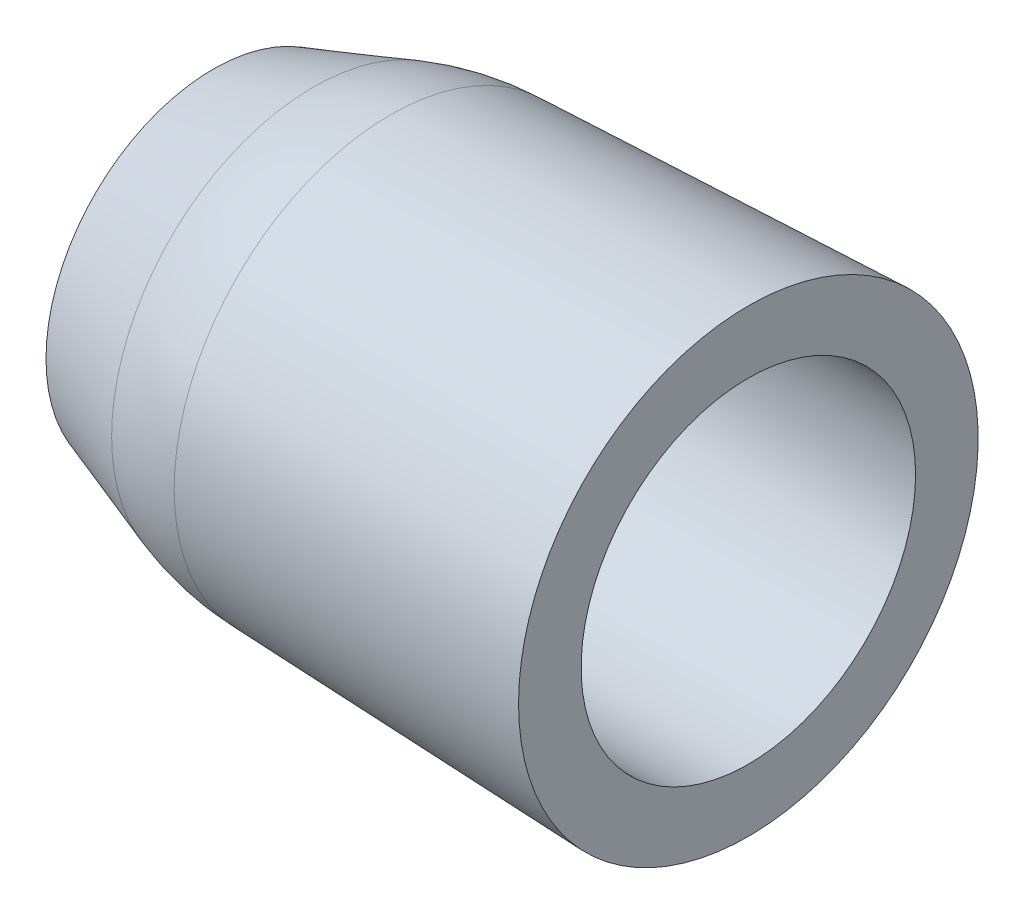
ISO-10303-21;
HEADER;
FILE_DESCRIPTION(('STEP AP214'),'2;1');
FILE_NAME('part.step','',(''),(''),'','','');
FILE_SCHEMA(('AUTOMOTIVE_DESIGN { 1 0 10303 214 1 1 1 1 }'));
ENDSEC;
DATA;
#1=APPLICATION_CONTEXT('core data for automotive mechanical design processes');
#2=APPLICATION_PROTOCOL_DEFINITION('international standard','automotive_design',2000,#1);
#3=PRODUCT_CONTEXT('',#1,'mechanical');
#4=PRODUCT('Part','Part','',(#3));
#5=PRODUCT_RELATED_PRODUCT_CATEGORY('part','',(#4));
#6=PRODUCT_DEFINITION_FORMATION('','',#4);
#7=PRODUCT_DEFINITION_CONTEXT('part definition',#1,'design');
#8=PRODUCT_DEFINITION('design','',#6,#7);
#9=PRODUCT_DEFINITION_SHAPE('','',#8);
#10=(LENGTH_UNIT() NAMED_UNIT(*) SI_UNIT(.MILLI.,.METRE.));
#11=(NAMED_UNIT(*) PLANE_ANGLE_UNIT() SI_UNIT($,.RADIAN.));
#12=(NAMED_UNIT(*) SI_UNIT($,.STERADIAN.) SOLID_ANGLE_UNIT());
#13=UNCERTAINTY_MEASURE_WITH_UNIT(LENGTH_MEASURE(1.E-05),#10,'distance_accuracy_value','');
#14=(GEOMETRIC_REPRESENTATION_CONTEXT(3) GLOBAL_UNCERTAINTY_ASSIGNED_CONTEXT((#13)) GLOBAL_UNIT_ASSIGNED_CONTEXT((#10,
#11,#12)) REPRESENTATION_CONTEXT('',''));
#15=CARTESIAN_POINT('',(0.,0.,0.));
#16=DIRECTION('',(0.,0.,1.));
#17=DIRECTION('',(1.,0.,0.));
#18=AXIS2_PLACEMENT_3D('',#15,#16,#17);
#19=CARTESIAN_POINT('',(-27.8094984746048,0.,0.));
#20=DIRECTION('',(1.,0.,0.));
#21=DIRECTION('',(0.,0.,-1.));
#22=AXIS2_PLACEMENT_3D('',#19,#20,#21);
#23=PLANE('',#22);
#24=CARTESIAN_POINT('',(-27.8094984746048,0.,0.));
#25=DIRECTION('',(-1.,0.,0.));
#26=DIRECTION('',(0.,0.,1.));
#27=AXIS2_PLACEMENT_3D('',#24,#25,#26);
#28=CIRCLE('',#27,7.9375);
#29=CARTESIAN_POINT('',(-27.8094984746048,0.,7.9375));
#30=VERTEX_POINT('',#29);
#31=EDGE_CURVE('E53',#30,#30,#28,.T.);
#32=ORIENTED_EDGE('',*,*,#31,.T.);
#33=EDGE_LOOP('',(#32));
#34=FACE_BOUND('',#33,.T.);
#35=ADVANCED_FACE('F38',(#34),#23,.F.);
#36=CARTESIAN_POINT('',(-2.40949847460481,0.,0.));
#37=DIRECTION('',(1.,0.,0.));
#38=DIRECTION('',(0.,0.,-1.));
#39=AXIS2_PLACEMENT_3D('',#36,#37,#38);
#40=PLANE('',#39);
#41=CARTESIAN_POINT('',(-2.40949847460481,0.,0.));
#42=DIRECTION('',(1.,0.,0.));
#43=DIRECTION('',(0.,0.,-1.));
#44=AXIS2_PLACEMENT_3D('',#41,#42,#43);
#45=CIRCLE('',#44,7.9375);
#46=CARTESIAN_POINT('',(-2.40949847460481,0.,-7.9375));
#47=VERTEX_POINT('',#46);
#48=EDGE_CURVE('E59',#47,#47,#45,.T.);
#49=ORIENTED_EDGE('',*,*,#48,.F.);
#50=EDGE_LOOP('',(#49));
#51=FACE_BOUND('',#50,.T.);
#52=CARTESIAN_POINT('',(-2.40949847460481,0.,0.));
#53=DIRECTION('',(-1.,0.,0.));
#54=DIRECTION('',(0.,0.,1.));
#55=AXIS2_PLACEMENT_3D('',#52,#53,#54);
#56=CIRCLE('',#55,10.9078164293921);
#57=CARTESIAN_POINT('',(-2.40949847460481,0.,10.9078164293921));
#58=VERTEX_POINT('',#57);
#59=EDGE_CURVE('E49',#58,#58,#56,.T.);
#60=ORIENTED_EDGE('',*,*,#59,.F.);
#61=EDGE_LOOP('',(#60));
#62=FACE_BOUND('',#61,.T.);
#63=ADVANCED_FACE('F74',(#51,#62),#40,.T.);
#64=CARTESIAN_POINT('',(-2.40949847460481,0.,0.));
#65=DIRECTION('',(1.,0.,0.));
#66=DIRECTION('',(0.,0.,-1.));
#67=AXIS2_PLACEMENT_3D('',#64,#65,#66);
#68=CONICAL_SURFACE('',#67,10.9078164293921,0.0381929089258036);
#69=CARTESIAN_POINT('',(-19.4046955685931,0.,0.));
#70=DIRECTION('',(-1.,0.,0.));
#71=DIRECTION('',(0.,0.,1.));
#72=AXIS2_PLACEMENT_3D('',#69,#70,#71);
#73=CIRCLE('',#72,10.2584046185942);
#74=CARTESIAN_POINT('',(-19.4046955685931,0.,10.2584046185942));
#75=VERTEX_POINT('',#74);
#76=EDGE_CURVE('E10',#75,#75,#73,.F.);
#77=ORIENTED_EDGE('',*,*,#76,.T.);
#78=EDGE_LOOP('',(#77));
#79=FACE_BOUND('',#78,.T.);
#80=ORIENTED_EDGE('',*,*,#59,.T.);
#81=EDGE_LOOP('',(#80));
#82=FACE_BOUND('',#81,.T.);
#83=ADVANCED_FACE('F77',(#79,#82),#68,.T.);
#84=CARTESIAN_POINT('',(-21.2812055003922,0.,0.));
#85=DIRECTION('',(1.,0.,0.));
#86=DIRECTION('',(0.,0.,-1.));
#87=AXIS2_PLACEMENT_3D('',#84,#85,#86);
#88=CONICAL_SURFACE('',#87,10.1867003773282,0.331794521903285);
#89=CARTESIAN_POINT('',(-23.0566640730012,0.,0.));
#90=DIRECTION('',(-1.,0.,0.));
#91=DIRECTION('',(0.,0.,1.));
#92=AXIS2_PLACEMENT_3D('',#89,#90,#91);
#93=CIRCLE('',#92,9.57499956867627);
#94=CARTESIAN_POINT('',(-23.0566640730012,0.,9.57499956867627));
#95=VERTEX_POINT('',#94);
#96=EDGE_CURVE('E45',#95,#95,#93,.T.);
#97=ORIENTED_EDGE('',*,*,#96,.T.);
#98=EDGE_LOOP('',(#97));
#99=FACE_BOUND('',#98,.T.);
#100=ORIENTED_EDGE('',*,*,#31,.F.);
#101=EDGE_LOOP('',(#100));
#102=FACE_BOUND('',#101,.T.);
#103=ADVANCED_FACE('F70',(#99,#102),#88,.T.);
#104=CARTESIAN_POINT('',(-27.5554984746048,0.,0.));
#105=DIRECTION('',(1.,0.,0.));
#106=DIRECTION('',(0.,0.,-1.));
#107=AXIS2_PLACEMENT_3D('',#104,#105,#106);
#108=CYLINDRICAL_SURFACE('',#107,7.9375);
#109=CARTESIAN_POINT('',(-27.5554984746048,0.,0.));
#110=DIRECTION('',(1.,0.,0.));
#111=DIRECTION('',(0.,0.,-1.));
#112=AXIS2_PLACEMENT_3D('',#109,#110,#111);
#113=CIRCLE('',#112,7.9375);
#114=CARTESIAN_POINT('',(-27.5554984746048,0.,-7.9375));
#115=VERTEX_POINT('',#114);
#116=EDGE_CURVE('E58',#115,#115,#113,.T.);
#117=ORIENTED_EDGE('',*,*,#116,.F.);
#118=EDGE_LOOP('',(#117));
#119=FACE_BOUND('',#118,.T.);
#120=ORIENTED_EDGE('',*,*,#48,.T.);
#121=EDGE_LOOP('',(#120));
#122=FACE_BOUND('',#121,.T.);
#123=ADVANCED_FACE('F67',(#119,#122),#108,.F.);
#124=CARTESIAN_POINT('',(-27.5554984746048,0.,0.));
#125=DIRECTION('',(1.,0.,0.));
#126=DIRECTION('',(0.,0.,-1.));
#127=AXIS2_PLACEMENT_3D('',#124,#125,#126);
#128=PLANE('',#127);
#129=ORIENTED_EDGE('',*,*,#116,.T.);
#130=EDGE_LOOP('',(#129));
#131=FACE_BOUND('',#130,.T.);
#132=ADVANCED_FACE('F65',(#131),#128,.T.);
#133=CARTESIAN_POINT('',(-18.9197635402223,0.,0.));
#134=DIRECTION('',(1.,0.,0.));
#135=DIRECTION('',(0.,0.,-1.));
#136=AXIS2_PLACEMENT_3D('',#133,#134,#135);
#137=DEGENERATE_TOROIDAL_SURFACE('',#136,2.43233377315672,12.7,.F.);
#138=ORIENTED_EDGE('',*,*,#76,.F.);
#139=EDGE_LOOP('',(#138));
#140=FACE_BOUND('',#139,.T.);
#141=ORIENTED_EDGE('',*,*,#96,.F.);
#142=EDGE_LOOP('',(#141));
#143=FACE_BOUND('',#142,.T.);
#144=ADVANCED_FACE('F40',(#140,#143),#137,.F.);
#145=CLOSED_SHELL('',(#35,#63,#83,#103,#123,#132,#144));
#146=MANIFOLD_SOLID_BREP('B2',#145);
#147=ADVANCED_BREP_SHAPE_REPRESENTATION('',(#18,#146),#14);
#148=SHAPE_DEFINITION_REPRESENTATION(#9,#147);
ENDSEC;
END-ISO-10303-21;
